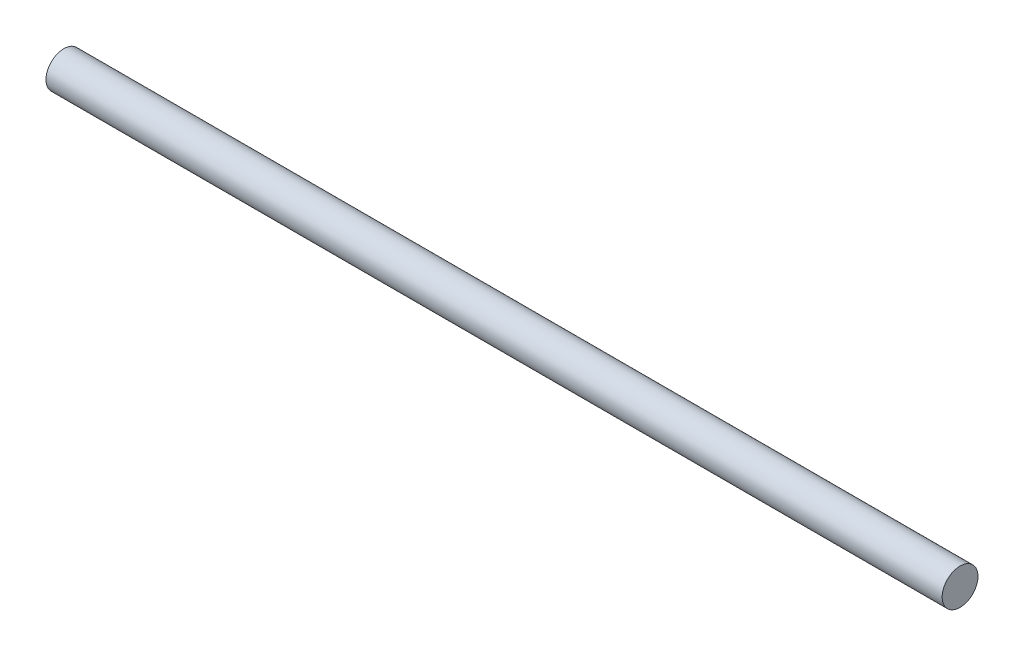
ISO-10303-21;
HEADER;
FILE_DESCRIPTION(('STEP AP214'),'2;1');
FILE_NAME('part.step','',(''),(''),'','','');
FILE_SCHEMA(('AUTOMOTIVE_DESIGN { 1 0 10303 214 1 1 1 1 }'));
ENDSEC;
DATA;
#1=APPLICATION_CONTEXT('core data for automotive mechanical design processes');
#2=APPLICATION_PROTOCOL_DEFINITION('international standard','automotive_design',2000,#1);
#3=PRODUCT_CONTEXT('',#1,'mechanical');
#4=PRODUCT('Part','Part','',(#3));
#5=PRODUCT_RELATED_PRODUCT_CATEGORY('part','',(#4));
#6=PRODUCT_DEFINITION_FORMATION('','',#4);
#7=PRODUCT_DEFINITION_CONTEXT('part definition',#1,'design');
#8=PRODUCT_DEFINITION('design','',#6,#7);
#9=PRODUCT_DEFINITION_SHAPE('','',#8);
#10=(LENGTH_UNIT() NAMED_UNIT(*) SI_UNIT(.MILLI.,.METRE.));
#11=(NAMED_UNIT(*) PLANE_ANGLE_UNIT() SI_UNIT($,.RADIAN.));
#12=(NAMED_UNIT(*) SI_UNIT($,.STERADIAN.) SOLID_ANGLE_UNIT());
#13=UNCERTAINTY_MEASURE_WITH_UNIT(LENGTH_MEASURE(1.E-05),#10,'distance_accuracy_value','');
#14=(GEOMETRIC_REPRESENTATION_CONTEXT(3) GLOBAL_UNCERTAINTY_ASSIGNED_CONTEXT((#13)) GLOBAL_UNIT_ASSIGNED_CONTEXT((#10,
#11,#12)) REPRESENTATION_CONTEXT('',''));
#15=CARTESIAN_POINT('',(0.,0.,0.));
#16=DIRECTION('',(0.,0.,1.));
#17=DIRECTION('',(1.,0.,0.));
#18=AXIS2_PLACEMENT_3D('',#15,#16,#17);
#19=CARTESIAN_POINT('',(100.,0.,0.));
#20=DIRECTION('',(-1.,0.,0.));
#21=DIRECTION('',(0.,0.,1.));
#22=AXIS2_PLACEMENT_3D('',#19,#20,#21);
#23=CYLINDRICAL_SURFACE('',#22,2.);
#24=CARTESIAN_POINT('',(100.,0.,0.));
#25=DIRECTION('',(1.,0.,0.));
#26=DIRECTION('',(0.,0.,-1.));
#27=AXIS2_PLACEMENT_3D('',#24,#25,#26);
#28=CIRCLE('',#27,2.);
#29=CARTESIAN_POINT('',(100.,0.,-2.));
#30=VERTEX_POINT('',#29);
#31=EDGE_CURVE('E10',#30,#30,#28,.T.);
#32=ORIENTED_EDGE('',*,*,#31,.F.);
#33=EDGE_LOOP('',(#32));
#34=FACE_BOUND('',#33,.T.);
#35=CARTESIAN_POINT('',(0.,0.,0.));
#36=DIRECTION('',(1.,0.,0.));
#37=DIRECTION('',(0.,0.,-1.));
#38=AXIS2_PLACEMENT_3D('',#35,#36,#37);
#39=CIRCLE('',#38,2.);
#40=CARTESIAN_POINT('',(0.,0.,-2.));
#41=VERTEX_POINT('',#40);
#42=EDGE_CURVE('E38',#41,#41,#39,.T.);
#43=ORIENTED_EDGE('',*,*,#42,.T.);
#44=EDGE_LOOP('',(#43));
#45=FACE_BOUND('',#44,.T.);
#46=ADVANCED_FACE('F35',(#34,#45),#23,.T.);
#47=CARTESIAN_POINT('',(100.,0.,0.));
#48=DIRECTION('',(1.,0.,0.));
#49=DIRECTION('',(0.,0.,-1.));
#50=AXIS2_PLACEMENT_3D('',#47,#48,#49);
#51=PLANE('',#50);
#52=ORIENTED_EDGE('',*,*,#31,.T.);
#53=EDGE_LOOP('',(#52));
#54=FACE_BOUND('',#53,.T.);
#55=ADVANCED_FACE('F50',(#54),#51,.T.);
#56=CARTESIAN_POINT('',(0.,0.,0.));
#57=DIRECTION('',(1.,0.,0.));
#58=DIRECTION('',(0.,0.,-1.));
#59=AXIS2_PLACEMENT_3D('',#56,#57,#58);
#60=PLANE('',#59);
#61=ORIENTED_EDGE('',*,*,#42,.F.);
#62=EDGE_LOOP('',(#61));
#63=FACE_BOUND('',#62,.T.);
#64=ADVANCED_FACE('F48',(#63),#60,.F.);
#65=CLOSED_SHELL('',(#46,#55,#64));
#66=MANIFOLD_SOLID_BREP('B2',#65);
#67=ADVANCED_BREP_SHAPE_REPRESENTATION('',(#18,#66),#14);
#68=SHAPE_DEFINITION_REPRESENTATION(#9,#67);
ENDSEC;
END-ISO-10303-21;
